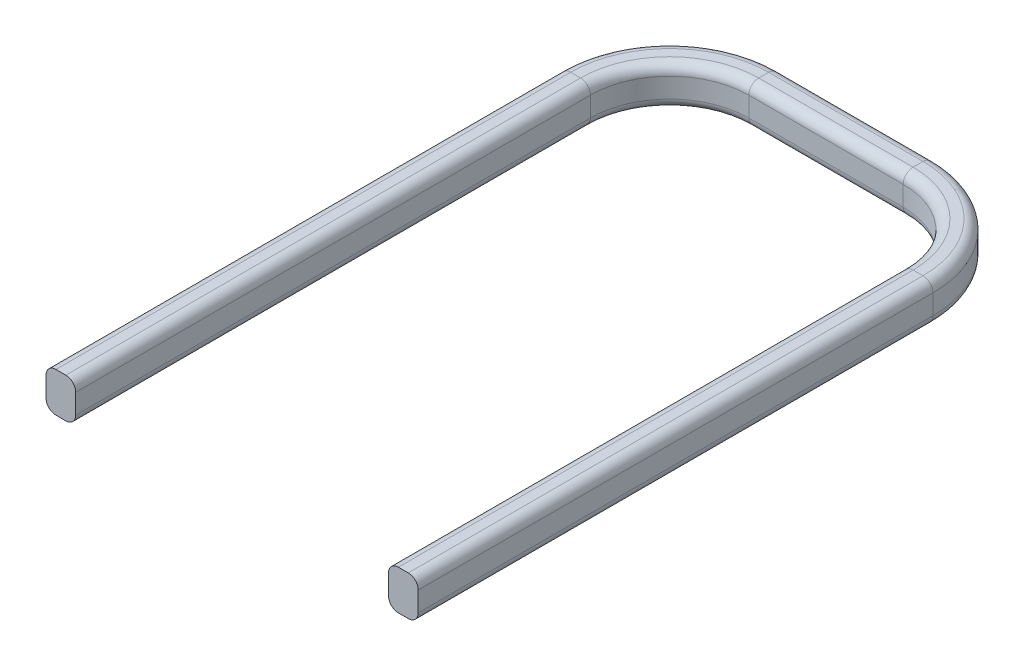
ISO-10303-21;
HEADER;
FILE_DESCRIPTION(('STEP AP214'),'2;1');
FILE_NAME('part.step','',(''),(''),'','','');
FILE_SCHEMA(('AUTOMOTIVE_DESIGN { 1 0 10303 214 1 1 1 1 }'));
ENDSEC;
DATA;
#1=APPLICATION_CONTEXT('core data for automotive mechanical design processes');
#2=APPLICATION_PROTOCOL_DEFINITION('international standard','automotive_design',2000,#1);
#3=PRODUCT_CONTEXT('',#1,'mechanical');
#4=PRODUCT('Part','Part','',(#3));
#5=PRODUCT_RELATED_PRODUCT_CATEGORY('part','',(#4));
#6=PRODUCT_DEFINITION_FORMATION('','',#4);
#7=PRODUCT_DEFINITION_CONTEXT('part definition',#1,'design');
#8=PRODUCT_DEFINITION('design','',#6,#7);
#9=PRODUCT_DEFINITION_SHAPE('','',#8);
#10=(LENGTH_UNIT() NAMED_UNIT(*) SI_UNIT(.MILLI.,.METRE.));
#11=(NAMED_UNIT(*) PLANE_ANGLE_UNIT() SI_UNIT($,.RADIAN.));
#12=(NAMED_UNIT(*) SI_UNIT($,.STERADIAN.) SOLID_ANGLE_UNIT());
#13=UNCERTAINTY_MEASURE_WITH_UNIT(LENGTH_MEASURE(1.E-05),#10,'distance_accuracy_value','');
#14=(GEOMETRIC_REPRESENTATION_CONTEXT(3) GLOBAL_UNCERTAINTY_ASSIGNED_CONTEXT((#13)) GLOBAL_UNIT_ASSIGNED_CONTEXT((#10,
#11,#12)) REPRESENTATION_CONTEXT('',''));
#15=CARTESIAN_POINT('',(0.,0.,0.));
#16=DIRECTION('',(0.,0.,1.));
#17=DIRECTION('',(1.,0.,0.));
#18=AXIS2_PLACEMENT_3D('',#15,#16,#17);
#19=CARTESIAN_POINT('',(0.,0.,0.));
#20=DIRECTION('',(0.,0.,1.));
#21=DIRECTION('',(1.,0.,0.));
#22=AXIS2_PLACEMENT_3D('',#19,#20,#21);
#23=PLANE('',#22);
#24=DIRECTION('',(0.,-1.,0.));
#25=VECTOR('',#24,1.);
#26=CARTESIAN_POINT('',(-4.7,0.,0.));
#27=LINE('',#26,#25);
#28=CARTESIAN_POINT('',(-4.7,0.75,0.));
#29=VERTEX_POINT('',#28);
#30=CARTESIAN_POINT('',(-4.7,0.25,0.));
#31=VERTEX_POINT('',#30);
#32=EDGE_CURVE('E413',#29,#31,#27,.T.);
#33=ORIENTED_EDGE('',*,*,#32,.T.);
#34=CARTESIAN_POINT('',(-4.45,0.25,0.));
#35=DIRECTION('',(0.,0.,1.));
#36=DIRECTION('',(1.,0.,0.));
#37=AXIS2_PLACEMENT_3D('',#34,#35,#36);
#38=CIRCLE('',#37,0.25);
#39=CARTESIAN_POINT('',(-4.45,0.,0.));
#40=VERTEX_POINT('',#39);
#41=EDGE_CURVE('E272',#31,#40,#38,.T.);
#42=ORIENTED_EDGE('',*,*,#41,.T.);
#43=DIRECTION('',(1.,0.,0.));
#44=VECTOR('',#43,1.);
#45=CARTESIAN_POINT('',(-3.95,0.,0.));
#46=LINE('',#45,#44);
#47=CARTESIAN_POINT('',(-4.2,0.,0.));
#48=VERTEX_POINT('',#47);
#49=EDGE_CURVE('E227',#40,#48,#46,.T.);
#50=ORIENTED_EDGE('',*,*,#49,.T.);
#51=CARTESIAN_POINT('',(-4.2,0.25,0.));
#52=DIRECTION('',(0.,0.,1.));
#53=DIRECTION('',(1.,0.,0.));
#54=AXIS2_PLACEMENT_3D('',#51,#52,#53);
#55=CIRCLE('',#54,0.25);
#56=CARTESIAN_POINT('',(-3.95,0.25,0.));
#57=VERTEX_POINT('',#56);
#58=EDGE_CURVE('E270',#48,#57,#55,.T.);
#59=ORIENTED_EDGE('',*,*,#58,.T.);
#60=DIRECTION('',(0.,1.,0.));
#61=VECTOR('',#60,1.);
#62=CARTESIAN_POINT('',(-3.95,0.,0.));
#63=LINE('',#62,#61);
#64=CARTESIAN_POINT('',(-3.95,0.75,0.));
#65=VERTEX_POINT('',#64);
#66=EDGE_CURVE('E356',#57,#65,#63,.T.);
#67=ORIENTED_EDGE('',*,*,#66,.T.);
#68=CARTESIAN_POINT('',(-4.2,0.75,0.));
#69=DIRECTION('',(0.,0.,1.));
#70=DIRECTION('',(1.,0.,0.));
#71=AXIS2_PLACEMENT_3D('',#68,#69,#70);
#72=CIRCLE('',#71,0.25);
#73=CARTESIAN_POINT('',(-4.2,1.,0.));
#74=VERTEX_POINT('',#73);
#75=EDGE_CURVE('E266',#65,#74,#72,.T.);
#76=ORIENTED_EDGE('',*,*,#75,.T.);
#77=DIRECTION('',(-1.,0.,0.));
#78=VECTOR('',#77,1.);
#79=CARTESIAN_POINT('',(-3.95,1.,0.));
#80=LINE('',#79,#78);
#81=CARTESIAN_POINT('',(-4.45,1.,0.));
#82=VERTEX_POINT('',#81);
#83=EDGE_CURVE('E411',#74,#82,#80,.T.);
#84=ORIENTED_EDGE('',*,*,#83,.T.);
#85=CARTESIAN_POINT('',(-4.45,0.75,0.));
#86=DIRECTION('',(0.,0.,1.));
#87=DIRECTION('',(1.,0.,0.));
#88=AXIS2_PLACEMENT_3D('',#85,#86,#87);
#89=CIRCLE('',#88,0.25);
#90=EDGE_CURVE('E268',#82,#29,#89,.T.);
#91=ORIENTED_EDGE('',*,*,#90,.T.);
#92=EDGE_LOOP('',(#33,#42,#50,#59,#67,#76,#84,#91));
#93=FACE_BOUND('',#92,.T.);
#94=ADVANCED_FACE('F33',(#93),#23,.T.);
#95=CARTESIAN_POINT('',(0.,0.,0.));
#96=DIRECTION('',(0.,0.,-1.));
#97=DIRECTION('',(-1.,0.,0.));
#98=AXIS2_PLACEMENT_3D('',#95,#96,#97);
#99=PLANE('',#98);
#100=DIRECTION('',(0.,1.,0.));
#101=VECTOR('',#100,1.);
#102=CARTESIAN_POINT('',(3.95,0.,0.));
#103=LINE('',#102,#101);
#104=CARTESIAN_POINT('',(3.95,0.25,0.));
#105=VERTEX_POINT('',#104);
#106=CARTESIAN_POINT('',(3.95,0.75,0.));
#107=VERTEX_POINT('',#106);
#108=EDGE_CURVE('E257',#105,#107,#103,.T.);
#109=ORIENTED_EDGE('',*,*,#108,.F.);
#110=CARTESIAN_POINT('',(4.2,0.25,0.));
#111=DIRECTION('',(0.,0.,-1.));
#112=DIRECTION('',(-1.,0.,0.));
#113=AXIS2_PLACEMENT_3D('',#110,#111,#112);
#114=CIRCLE('',#113,0.25);
#115=CARTESIAN_POINT('',(4.2,0.,0.));
#116=VERTEX_POINT('',#115);
#117=EDGE_CURVE('E309',#105,#116,#114,.F.);
#118=ORIENTED_EDGE('',*,*,#117,.T.);
#119=DIRECTION('',(-1.,0.,0.));
#120=VECTOR('',#119,1.);
#121=CARTESIAN_POINT('',(3.95,0.,0.));
#122=LINE('',#121,#120);
#123=CARTESIAN_POINT('',(4.45,0.,0.));
#124=VERTEX_POINT('',#123);
#125=EDGE_CURVE('E259',#124,#116,#122,.T.);
#126=ORIENTED_EDGE('',*,*,#125,.F.);
#127=CARTESIAN_POINT('',(4.45,0.25,0.));
#128=DIRECTION('',(0.,0.,-1.));
#129=DIRECTION('',(-1.,0.,0.));
#130=AXIS2_PLACEMENT_3D('',#127,#128,#129);
#131=CIRCLE('',#130,0.25);
#132=CARTESIAN_POINT('',(4.7,0.25,0.));
#133=VERTEX_POINT('',#132);
#134=EDGE_CURVE('E303',#124,#133,#131,.F.);
#135=ORIENTED_EDGE('',*,*,#134,.T.);
#136=DIRECTION('',(0.,-1.,0.));
#137=VECTOR('',#136,1.);
#138=CARTESIAN_POINT('',(4.7,0.,0.));
#139=LINE('',#138,#137);
#140=CARTESIAN_POINT('',(4.7,0.75,0.));
#141=VERTEX_POINT('',#140);
#142=EDGE_CURVE('E262',#141,#133,#139,.T.);
#143=ORIENTED_EDGE('',*,*,#142,.F.);
#144=CARTESIAN_POINT('',(4.45,0.75,0.));
#145=DIRECTION('',(0.,0.,-1.));
#146=DIRECTION('',(-1.,0.,0.));
#147=AXIS2_PLACEMENT_3D('',#144,#145,#146);
#148=CIRCLE('',#147,0.25);
#149=CARTESIAN_POINT('',(4.45,1.,0.));
#150=VERTEX_POINT('',#149);
#151=EDGE_CURVE('E307',#141,#150,#148,.F.);
#152=ORIENTED_EDGE('',*,*,#151,.T.);
#153=DIRECTION('',(1.,0.,0.));
#154=VECTOR('',#153,1.);
#155=CARTESIAN_POINT('',(3.95,1.,0.));
#156=LINE('',#155,#154);
#157=CARTESIAN_POINT('',(4.2,1.,0.));
#158=VERTEX_POINT('',#157);
#159=EDGE_CURVE('E424',#158,#150,#156,.T.);
#160=ORIENTED_EDGE('',*,*,#159,.F.);
#161=CARTESIAN_POINT('',(4.2,0.75,0.));
#162=DIRECTION('',(0.,0.,-1.));
#163=DIRECTION('',(-1.,0.,0.));
#164=AXIS2_PLACEMENT_3D('',#161,#162,#163);
#165=CIRCLE('',#164,0.25);
#166=EDGE_CURVE('E305',#158,#107,#165,.F.);
#167=ORIENTED_EDGE('',*,*,#166,.T.);
#168=EDGE_LOOP('',(#109,#118,#126,#135,#143,#152,#160,#167));
#169=FACE_BOUND('',#168,.T.);
#170=ADVANCED_FACE('F481',(#169),#99,.F.);
#171=CARTESIAN_POINT('',(-3.95,0.,0.));
#172=DIRECTION('',(-1.,0.,0.));
#173=DIRECTION('',(0.,0.,1.));
#174=AXIS2_PLACEMENT_3D('',#171,#172,#173);
#175=PLANE('',#174);
#176=ORIENTED_EDGE('',*,*,#66,.F.);
#177=DIRECTION('',(0.,0.,-1.));
#178=VECTOR('',#177,1.);
#179=CARTESIAN_POINT('',(-3.95,0.25,0.));
#180=LINE('',#179,#178);
#181=CARTESIAN_POINT('',(-3.95,0.25,-13.));
#182=VERTEX_POINT('',#181);
#183=EDGE_CURVE('E296',#57,#182,#180,.T.);
#184=ORIENTED_EDGE('',*,*,#183,.T.);
#185=DIRECTION('',(0.,1.,0.));
#186=VECTOR('',#185,1.);
#187=CARTESIAN_POINT('',(-3.95,0.,-13.));
#188=LINE('',#187,#186);
#189=CARTESIAN_POINT('',(-3.95,0.75,-13.));
#190=VERTEX_POINT('',#189);
#191=EDGE_CURVE('E406',#182,#190,#188,.T.);
#192=ORIENTED_EDGE('',*,*,#191,.T.);
#193=DIRECTION('',(0.,0.,-1.));
#194=VECTOR('',#193,1.);
#195=CARTESIAN_POINT('',(-3.95,0.75,0.));
#196=LINE('',#195,#194);
#197=EDGE_CURVE('E294',#190,#65,#196,.F.);
#198=ORIENTED_EDGE('',*,*,#197,.T.);
#199=EDGE_LOOP('',(#176,#184,#192,#198));
#200=FACE_BOUND('',#199,.T.);
#201=ADVANCED_FACE('F403',(#200),#175,.F.);
#202=CARTESIAN_POINT('',(-3.95,1.,0.));
#203=DIRECTION('',(0.,-1.,0.));
#204=DIRECTION('',(1.,0.,0.));
#205=AXIS2_PLACEMENT_3D('',#202,#203,#204);
#206=PLANE('',#205);
#207=DIRECTION('',(-1.,0.,0.));
#208=VECTOR('',#207,1.);
#209=CARTESIAN_POINT('',(-3.95,1.,-13.));
#210=LINE('',#209,#208);
#211=CARTESIAN_POINT('',(-4.2,1.,-13.));
#212=VERTEX_POINT('',#211);
#213=CARTESIAN_POINT('',(-4.45,1.,-13.));
#214=VERTEX_POINT('',#213);
#215=EDGE_CURVE('E240',#212,#214,#210,.T.);
#216=ORIENTED_EDGE('',*,*,#215,.T.);
#217=DIRECTION('',(0.,0.,-1.));
#218=VECTOR('',#217,1.);
#219=CARTESIAN_POINT('',(-4.45,1.,0.));
#220=LINE('',#219,#218);
#221=EDGE_CURVE('E11',#214,#82,#220,.F.);
#222=ORIENTED_EDGE('',*,*,#221,.T.);
#223=ORIENTED_EDGE('',*,*,#83,.F.);
#224=DIRECTION('',(0.,0.,-1.));
#225=VECTOR('',#224,1.);
#226=CARTESIAN_POINT('',(-4.2,1.,0.));
#227=LINE('',#226,#225);
#228=EDGE_CURVE('E42',#74,#212,#227,.T.);
#229=ORIENTED_EDGE('',*,*,#228,.T.);
#230=EDGE_LOOP('',(#216,#222,#223,#229));
#231=FACE_BOUND('',#230,.T.);
#232=ADVANCED_FACE('F828',(#231),#206,.F.);
#233=CARTESIAN_POINT('',(-4.7,0.,0.));
#234=DIRECTION('',(1.,0.,0.));
#235=DIRECTION('',(0.,0.,-1.));
#236=AXIS2_PLACEMENT_3D('',#233,#234,#235);
#237=PLANE('',#236);
#238=DIRECTION('',(0.,-1.,0.));
#239=VECTOR('',#238,1.);
#240=CARTESIAN_POINT('',(-4.7,0.,-13.));
#241=LINE('',#240,#239);
#242=CARTESIAN_POINT('',(-4.7,0.75,-13.));
#243=VERTEX_POINT('',#242);
#244=CARTESIAN_POINT('',(-4.7,0.25,-13.));
#245=VERTEX_POINT('',#244);
#246=EDGE_CURVE('E234',#243,#245,#241,.T.);
#247=ORIENTED_EDGE('',*,*,#246,.T.);
#248=DIRECTION('',(0.,0.,-1.));
#249=VECTOR('',#248,1.);
#250=CARTESIAN_POINT('',(-4.7,0.25,0.));
#251=LINE('',#250,#249);
#252=EDGE_CURVE('E203',#245,#31,#251,.F.);
#253=ORIENTED_EDGE('',*,*,#252,.T.);
#254=ORIENTED_EDGE('',*,*,#32,.F.);
#255=DIRECTION('',(0.,0.,-1.));
#256=VECTOR('',#255,1.);
#257=CARTESIAN_POINT('',(-4.7,0.75,0.));
#258=LINE('',#257,#256);
#259=EDGE_CURVE('E228',#29,#243,#258,.T.);
#260=ORIENTED_EDGE('',*,*,#259,.T.);
#261=EDGE_LOOP('',(#247,#253,#254,#260));
#262=FACE_BOUND('',#261,.T.);
#263=ADVANCED_FACE('F519',(#262),#237,.F.);
#264=CARTESIAN_POINT('',(-3.95,0.,0.));
#265=DIRECTION('',(0.,1.,0.));
#266=DIRECTION('',(-1.,0.,0.));
#267=AXIS2_PLACEMENT_3D('',#264,#265,#266);
#268=PLANE('',#267);
#269=ORIENTED_EDGE('',*,*,#49,.F.);
#270=DIRECTION('',(0.,0.,-1.));
#271=VECTOR('',#270,1.);
#272=CARTESIAN_POINT('',(-4.45,0.,0.));
#273=LINE('',#272,#271);
#274=CARTESIAN_POINT('',(-4.45,0.,-13.));
#275=VERTEX_POINT('',#274);
#276=EDGE_CURVE('E202',#40,#275,#273,.T.);
#277=ORIENTED_EDGE('',*,*,#276,.T.);
#278=DIRECTION('',(1.,0.,0.));
#279=VECTOR('',#278,1.);
#280=CARTESIAN_POINT('',(-3.95,0.,-13.));
#281=LINE('',#280,#279);
#282=CARTESIAN_POINT('',(-4.2,0.,-13.));
#283=VERTEX_POINT('',#282);
#284=EDGE_CURVE('E224',#275,#283,#281,.T.);
#285=ORIENTED_EDGE('',*,*,#284,.T.);
#286=DIRECTION('',(0.,0.,-1.));
#287=VECTOR('',#286,1.);
#288=CARTESIAN_POINT('',(-4.2,0.,0.));
#289=LINE('',#288,#287);
#290=EDGE_CURVE('E229',#283,#48,#289,.F.);
#291=ORIENTED_EDGE('',*,*,#290,.T.);
#292=EDGE_LOOP('',(#269,#277,#285,#291));
#293=FACE_BOUND('',#292,.T.);
#294=ADVANCED_FACE('F223',(#293),#268,.F.);
#295=CARTESIAN_POINT('',(-1.95,0.,-13.));
#296=DIRECTION('',(0.,-1.,0.));
#297=DIRECTION('',(0.,0.,-1.));
#298=AXIS2_PLACEMENT_3D('',#295,#296,#297);
#299=CYLINDRICAL_SURFACE('',#298,2.);
#300=DIRECTION('',(0.,1.,0.));
#301=VECTOR('',#300,1.);
#302=CARTESIAN_POINT('',(-1.95,0.,-15.));
#303=LINE('',#302,#301);
#304=CARTESIAN_POINT('',(-1.95,0.25,-15.));
#305=VERTEX_POINT('',#304);
#306=CARTESIAN_POINT('',(-1.95,0.75,-15.));
#307=VERTEX_POINT('',#306);
#308=EDGE_CURVE('E233',#305,#307,#303,.T.);
#309=ORIENTED_EDGE('',*,*,#308,.T.);
#310=CARTESIAN_POINT('',(-1.95,0.75,-13.));
#311=DIRECTION('',(0.,-1.,0.));
#312=DIRECTION('',(0.,0.,-1.));
#313=AXIS2_PLACEMENT_3D('',#310,#311,#312);
#314=CIRCLE('',#313,2.);
#315=EDGE_CURVE('E346',#307,#190,#314,.F.);
#316=ORIENTED_EDGE('',*,*,#315,.T.);
#317=ORIENTED_EDGE('',*,*,#191,.F.);
#318=CARTESIAN_POINT('',(-1.95,0.25,-13.));
#319=DIRECTION('',(0.,1.,0.));
#320=DIRECTION('',(0.,0.,1.));
#321=AXIS2_PLACEMENT_3D('',#318,#319,#320);
#322=CIRCLE('',#321,2.);
#323=EDGE_CURVE('E344',#182,#305,#322,.F.);
#324=ORIENTED_EDGE('',*,*,#323,.T.);
#325=EDGE_LOOP('',(#309,#316,#317,#324));
#326=FACE_BOUND('',#325,.T.);
#327=ADVANCED_FACE('F805',(#326),#299,.F.);
#328=CARTESIAN_POINT('',(-3.95,1.,-13.));
#329=DIRECTION('',(0.,-1.,0.));
#330=DIRECTION('',(0.,0.,-1.));
#331=AXIS2_PLACEMENT_3D('',#328,#329,#330);
#332=PLANE('',#331);
#333=DIRECTION('',(0.,0.,-1.));
#334=VECTOR('',#333,1.);
#335=CARTESIAN_POINT('',(-1.95,1.,-15.));
#336=LINE('',#335,#334);
#337=CARTESIAN_POINT('',(-1.95,1.,-15.25));
#338=VERTEX_POINT('',#337);
#339=CARTESIAN_POINT('',(-1.95,1.,-15.5));
#340=VERTEX_POINT('',#339);
#341=EDGE_CURVE('E237',#338,#340,#336,.T.);
#342=ORIENTED_EDGE('',*,*,#341,.T.);
#343=CARTESIAN_POINT('',(-1.95,1.,-13.));
#344=DIRECTION('',(0.,-1.,0.));
#345=DIRECTION('',(0.,0.,-1.));
#346=AXIS2_PLACEMENT_3D('',#343,#344,#345);
#347=CIRCLE('',#346,2.5);
#348=EDGE_CURVE('E50',#340,#214,#347,.F.);
#349=ORIENTED_EDGE('',*,*,#348,.T.);
#350=ORIENTED_EDGE('',*,*,#215,.F.);
#351=CARTESIAN_POINT('',(-1.95,1.,-13.));
#352=DIRECTION('',(0.,-1.,0.));
#353=DIRECTION('',(0.,0.,-1.));
#354=AXIS2_PLACEMENT_3D('',#351,#352,#353);
#355=CIRCLE('',#354,2.25);
#356=EDGE_CURVE('E341',#212,#338,#355,.T.);
#357=ORIENTED_EDGE('',*,*,#356,.T.);
#358=EDGE_LOOP('',(#342,#349,#350,#357));
#359=FACE_BOUND('',#358,.T.);
#360=ADVANCED_FACE('F797',(#359),#332,.F.);
#361=CARTESIAN_POINT('',(-1.95,0.,-13.));
#362=DIRECTION('',(0.,-1.,0.));
#363=DIRECTION('',(0.,0.,-1.));
#364=AXIS2_PLACEMENT_3D('',#361,#362,#363);
#365=CYLINDRICAL_SURFACE('',#364,2.75);
#366=DIRECTION('',(0.,-1.,0.));
#367=VECTOR('',#366,1.);
#368=CARTESIAN_POINT('',(-1.95,0.,-15.75));
#369=LINE('',#368,#367);
#370=CARTESIAN_POINT('',(-1.95,0.75,-15.75));
#371=VERTEX_POINT('',#370);
#372=CARTESIAN_POINT('',(-1.95,0.25,-15.75));
#373=VERTEX_POINT('',#372);
#374=EDGE_CURVE('E248',#371,#373,#369,.T.);
#375=ORIENTED_EDGE('',*,*,#374,.T.);
#376=CARTESIAN_POINT('',(-1.95,0.25,-13.));
#377=DIRECTION('',(0.,1.,0.));
#378=DIRECTION('',(0.,0.,1.));
#379=AXIS2_PLACEMENT_3D('',#376,#377,#378);
#380=CIRCLE('',#379,2.75);
#381=EDGE_CURVE('E276',#373,#245,#380,.T.);
#382=ORIENTED_EDGE('',*,*,#381,.T.);
#383=ORIENTED_EDGE('',*,*,#246,.F.);
#384=CARTESIAN_POINT('',(-1.95,0.75,-13.));
#385=DIRECTION('',(0.,-1.,0.));
#386=DIRECTION('',(0.,0.,-1.));
#387=AXIS2_PLACEMENT_3D('',#384,#385,#386);
#388=CIRCLE('',#387,2.75);
#389=EDGE_CURVE('E217',#243,#371,#388,.T.);
#390=ORIENTED_EDGE('',*,*,#389,.T.);
#391=EDGE_LOOP('',(#375,#382,#383,#390));
#392=FACE_BOUND('',#391,.T.);
#393=ADVANCED_FACE('F516',(#392),#365,.T.);
#394=CARTESIAN_POINT('',(-3.95,0.,-13.));
#395=DIRECTION('',(0.,1.,0.));
#396=DIRECTION('',(0.,0.,1.));
#397=AXIS2_PLACEMENT_3D('',#394,#395,#396);
#398=PLANE('',#397);
#399=ORIENTED_EDGE('',*,*,#284,.F.);
#400=CARTESIAN_POINT('',(-1.95,0.,-13.));
#401=DIRECTION('',(0.,1.,0.));
#402=DIRECTION('',(0.,0.,1.));
#403=AXIS2_PLACEMENT_3D('',#400,#401,#402);
#404=CIRCLE('',#403,2.5);
#405=CARTESIAN_POINT('',(-1.95,0.,-15.5));
#406=VERTEX_POINT('',#405);
#407=EDGE_CURVE('E210',#275,#406,#404,.F.);
#408=ORIENTED_EDGE('',*,*,#407,.T.);
#409=DIRECTION('',(0.,0.,1.));
#410=VECTOR('',#409,1.);
#411=CARTESIAN_POINT('',(-1.95,0.,-15.));
#412=LINE('',#411,#410);
#413=CARTESIAN_POINT('',(-1.95,0.,-15.25));
#414=VERTEX_POINT('',#413);
#415=EDGE_CURVE('E245',#406,#414,#412,.T.);
#416=ORIENTED_EDGE('',*,*,#415,.T.);
#417=CARTESIAN_POINT('',(-1.95,0.,-13.));
#418=DIRECTION('',(0.,1.,0.));
#419=DIRECTION('',(0.,0.,1.));
#420=AXIS2_PLACEMENT_3D('',#417,#418,#419);
#421=CIRCLE('',#420,2.25);
#422=EDGE_CURVE('E218',#414,#283,#421,.T.);
#423=ORIENTED_EDGE('',*,*,#422,.T.);
#424=EDGE_LOOP('',(#399,#408,#416,#423));
#425=FACE_BOUND('',#424,.T.);
#426=ADVANCED_FACE('F231',(#425),#398,.F.);
#427=CARTESIAN_POINT('',(-1.95,0.,-15.));
#428=DIRECTION('',(0.,0.,-1.));
#429=DIRECTION('',(-1.,0.,0.));
#430=AXIS2_PLACEMENT_3D('',#427,#428,#429);
#431=PLANE('',#430);
#432=ORIENTED_EDGE('',*,*,#308,.F.);
#433=DIRECTION('',(1.,0.,0.));
#434=VECTOR('',#433,1.);
#435=CARTESIAN_POINT('',(-1.95,0.25,-15.));
#436=LINE('',#435,#434);
#437=CARTESIAN_POINT('',(1.94999999999999,0.25,-15.));
#438=VERTEX_POINT('',#437);
#439=EDGE_CURVE('E321',#305,#438,#436,.T.);
#440=ORIENTED_EDGE('',*,*,#439,.T.);
#441=DIRECTION('',(0.,1.,0.));
#442=VECTOR('',#441,1.);
#443=CARTESIAN_POINT('',(1.94999999999999,0.,-15.));
#444=LINE('',#443,#442);
#445=CARTESIAN_POINT('',(1.94999999999999,0.75,-15.));
#446=VERTEX_POINT('',#445);
#447=EDGE_CURVE('E247',#438,#446,#444,.T.);
#448=ORIENTED_EDGE('',*,*,#447,.T.);
#449=DIRECTION('',(1.,0.,0.));
#450=VECTOR('',#449,1.);
#451=CARTESIAN_POINT('',(-1.95,0.75,-15.));
#452=LINE('',#451,#450);
#453=EDGE_CURVE('E319',#446,#307,#452,.F.);
#454=ORIENTED_EDGE('',*,*,#453,.T.);
#455=EDGE_LOOP('',(#432,#440,#448,#454));
#456=FACE_BOUND('',#455,.T.);
#457=ADVANCED_FACE('F773',(#456),#431,.F.);
#458=CARTESIAN_POINT('',(-1.95,1.,-15.));
#459=DIRECTION('',(0.,-1.,0.));
#460=DIRECTION('',(0.,0.,-1.));
#461=AXIS2_PLACEMENT_3D('',#458,#459,#460);
#462=PLANE('',#461);
#463=DIRECTION('',(0.,0.,-1.));
#464=VECTOR('',#463,1.);
#465=CARTESIAN_POINT('',(1.94999999999999,1.,-15.));
#466=LINE('',#465,#464);
#467=CARTESIAN_POINT('',(1.94999999999999,1.,-15.25));
#468=VERTEX_POINT('',#467);
#469=CARTESIAN_POINT('',(1.94999999999999,1.,-15.5));
#470=VERTEX_POINT('',#469);
#471=EDGE_CURVE('E419',#468,#470,#466,.T.);
#472=ORIENTED_EDGE('',*,*,#471,.T.);
#473=DIRECTION('',(1.,0.,0.));
#474=VECTOR('',#473,1.);
#475=CARTESIAN_POINT('',(-1.95,1.,-15.5));
#476=LINE('',#475,#474);
#477=EDGE_CURVE('E339',#470,#340,#476,.F.);
#478=ORIENTED_EDGE('',*,*,#477,.T.);
#479=ORIENTED_EDGE('',*,*,#341,.F.);
#480=DIRECTION('',(1.,0.,0.));
#481=VECTOR('',#480,1.);
#482=CARTESIAN_POINT('',(-1.95,1.,-15.25));
#483=LINE('',#482,#481);
#484=EDGE_CURVE('E337',#338,#468,#483,.T.);
#485=ORIENTED_EDGE('',*,*,#484,.T.);
#486=EDGE_LOOP('',(#472,#478,#479,#485));
#487=FACE_BOUND('',#486,.T.);
#488=ADVANCED_FACE('F765',(#487),#462,.F.);
#489=CARTESIAN_POINT('',(-1.95,0.,-15.75));
#490=DIRECTION('',(0.,0.,1.));
#491=DIRECTION('',(1.,0.,0.));
#492=AXIS2_PLACEMENT_3D('',#489,#490,#491);
#493=PLANE('',#492);
#494=DIRECTION('',(0.,-1.,0.));
#495=VECTOR('',#494,1.);
#496=CARTESIAN_POINT('',(1.94999999999999,0.,-15.75));
#497=LINE('',#496,#495);
#498=CARTESIAN_POINT('',(1.94999999999999,0.75,-15.75));
#499=VERTEX_POINT('',#498);
#500=CARTESIAN_POINT('',(1.94999999999999,0.25,-15.75));
#501=VERTEX_POINT('',#500);
#502=EDGE_CURVE('E253',#499,#501,#497,.T.);
#503=ORIENTED_EDGE('',*,*,#502,.T.);
#504=DIRECTION('',(1.,0.,0.));
#505=VECTOR('',#504,1.);
#506=CARTESIAN_POINT('',(-1.95,0.25,-15.75));
#507=LINE('',#506,#505);
#508=EDGE_CURVE('E284',#501,#373,#507,.F.);
#509=ORIENTED_EDGE('',*,*,#508,.T.);
#510=ORIENTED_EDGE('',*,*,#374,.F.);
#511=DIRECTION('',(1.,0.,0.));
#512=VECTOR('',#511,1.);
#513=CARTESIAN_POINT('',(-1.95,0.75,-15.75));
#514=LINE('',#513,#512);
#515=EDGE_CURVE('E282',#371,#499,#514,.T.);
#516=ORIENTED_EDGE('',*,*,#515,.T.);
#517=EDGE_LOOP('',(#503,#509,#510,#516));
#518=FACE_BOUND('',#517,.T.);
#519=ADVANCED_FACE('F464',(#518),#493,.F.);
#520=CARTESIAN_POINT('',(-1.95,0.,-15.));
#521=DIRECTION('',(0.,1.,0.));
#522=DIRECTION('',(0.,0.,1.));
#523=AXIS2_PLACEMENT_3D('',#520,#521,#522);
#524=PLANE('',#523);
#525=ORIENTED_EDGE('',*,*,#415,.F.);
#526=DIRECTION('',(1.,0.,0.));
#527=VECTOR('',#526,1.);
#528=CARTESIAN_POINT('',(-1.95,0.,-15.5));
#529=LINE('',#528,#527);
#530=CARTESIAN_POINT('',(1.94999999999999,0.,-15.5));
#531=VERTEX_POINT('',#530);
#532=EDGE_CURVE('E280',#406,#531,#529,.T.);
#533=ORIENTED_EDGE('',*,*,#532,.T.);
#534=DIRECTION('',(0.,0.,1.));
#535=VECTOR('',#534,1.);
#536=CARTESIAN_POINT('',(1.94999999999999,0.,-15.));
#537=LINE('',#536,#535);
#538=CARTESIAN_POINT('',(1.94999999999999,0.,-15.25));
#539=VERTEX_POINT('',#538);
#540=EDGE_CURVE('E249',#531,#539,#537,.T.);
#541=ORIENTED_EDGE('',*,*,#540,.T.);
#542=DIRECTION('',(1.,0.,0.));
#543=VECTOR('',#542,1.);
#544=CARTESIAN_POINT('',(-1.95,0.,-15.25));
#545=LINE('',#544,#543);
#546=EDGE_CURVE('E278',#539,#414,#545,.F.);
#547=ORIENTED_EDGE('',*,*,#546,.T.);
#548=EDGE_LOOP('',(#525,#533,#541,#547));
#549=FACE_BOUND('',#548,.T.);
#550=ADVANCED_FACE('F510',(#549),#524,.F.);
#551=CARTESIAN_POINT('',(1.95,0.,-13.));
#552=DIRECTION('',(0.,-1.,0.));
#553=DIRECTION('',(0.,0.,-1.));
#554=AXIS2_PLACEMENT_3D('',#551,#552,#553);
#555=CYLINDRICAL_SURFACE('',#554,2.);
#556=ORIENTED_EDGE('',*,*,#447,.F.);
#557=CARTESIAN_POINT('',(1.95,0.25,-13.));
#558=DIRECTION('',(0.,1.,0.));
#559=DIRECTION('',(0.,0.,1.));
#560=AXIS2_PLACEMENT_3D('',#557,#558,#559);
#561=CIRCLE('',#560,2.);
#562=CARTESIAN_POINT('',(3.95,0.25,-13.));
#563=VERTEX_POINT('',#562);
#564=EDGE_CURVE('E317',#438,#563,#561,.F.);
#565=ORIENTED_EDGE('',*,*,#564,.T.);
#566=DIRECTION('',(0.,1.,0.));
#567=VECTOR('',#566,1.);
#568=CARTESIAN_POINT('',(3.95,0.,-13.));
#569=LINE('',#568,#567);
#570=CARTESIAN_POINT('',(3.95,0.75,-13.));
#571=VERTEX_POINT('',#570);
#572=EDGE_CURVE('E252',#563,#571,#569,.T.);
#573=ORIENTED_EDGE('',*,*,#572,.T.);
#574=CARTESIAN_POINT('',(1.95,0.75,-13.));
#575=DIRECTION('',(0.,-1.,0.));
#576=DIRECTION('',(0.,0.,-1.));
#577=AXIS2_PLACEMENT_3D('',#574,#575,#576);
#578=CIRCLE('',#577,2.);
#579=EDGE_CURVE('E315',#571,#446,#578,.F.);
#580=ORIENTED_EDGE('',*,*,#579,.T.);
#581=EDGE_LOOP('',(#556,#565,#573,#580));
#582=FACE_BOUND('',#581,.T.);
#583=ADVANCED_FACE('F742',(#582),#555,.F.);
#584=CARTESIAN_POINT('',(1.94999999999999,1.,-15.));
#585=DIRECTION('',(0.,-1.,0.));
#586=DIRECTION('',(0.,0.,-1.));
#587=AXIS2_PLACEMENT_3D('',#584,#585,#586);
#588=PLANE('',#587);
#589=DIRECTION('',(1.,0.,0.));
#590=VECTOR('',#589,1.);
#591=CARTESIAN_POINT('',(3.95,1.,-13.));
#592=LINE('',#591,#590);
#593=CARTESIAN_POINT('',(4.2,1.,-13.));
#594=VERTEX_POINT('',#593);
#595=CARTESIAN_POINT('',(4.45,1.,-13.));
#596=VERTEX_POINT('',#595);
#597=EDGE_CURVE('E422',#594,#596,#592,.T.);
#598=ORIENTED_EDGE('',*,*,#597,.T.);
#599=CARTESIAN_POINT('',(1.95,1.,-13.));
#600=DIRECTION('',(0.,-1.,0.));
#601=DIRECTION('',(0.,0.,-1.));
#602=AXIS2_PLACEMENT_3D('',#599,#600,#601);
#603=CIRCLE('',#602,2.5);
#604=EDGE_CURVE('E335',#596,#470,#603,.F.);
#605=ORIENTED_EDGE('',*,*,#604,.T.);
#606=ORIENTED_EDGE('',*,*,#471,.F.);
#607=CARTESIAN_POINT('',(1.95,1.,-13.));
#608=DIRECTION('',(0.,-1.,0.));
#609=DIRECTION('',(0.,0.,-1.));
#610=AXIS2_PLACEMENT_3D('',#607,#608,#609);
#611=CIRCLE('',#610,2.25);
#612=EDGE_CURVE('E333',#468,#594,#611,.T.);
#613=ORIENTED_EDGE('',*,*,#612,.T.);
#614=EDGE_LOOP('',(#598,#605,#606,#613));
#615=FACE_BOUND('',#614,.T.);
#616=ADVANCED_FACE('F734',(#615),#588,.F.);
#617=CARTESIAN_POINT('',(1.95,0.,-13.));
#618=DIRECTION('',(0.,-1.,0.));
#619=DIRECTION('',(0.,0.,-1.));
#620=AXIS2_PLACEMENT_3D('',#617,#618,#619);
#621=CYLINDRICAL_SURFACE('',#620,2.75);
#622=DIRECTION('',(0.,-1.,0.));
#623=VECTOR('',#622,1.);
#624=CARTESIAN_POINT('',(4.7,0.,-13.));
#625=LINE('',#624,#623);
#626=CARTESIAN_POINT('',(4.7,0.75,-13.));
#627=VERTEX_POINT('',#626);
#628=CARTESIAN_POINT('',(4.7,0.25,-13.));
#629=VERTEX_POINT('',#628);
#630=EDGE_CURVE('E258',#627,#629,#625,.T.);
#631=ORIENTED_EDGE('',*,*,#630,.T.);
#632=CARTESIAN_POINT('',(1.95,0.25,-13.));
#633=DIRECTION('',(0.,1.,0.));
#634=DIRECTION('',(0.,0.,1.));
#635=AXIS2_PLACEMENT_3D('',#632,#633,#634);
#636=CIRCLE('',#635,2.75);
#637=EDGE_CURVE('E292',#629,#501,#636,.T.);
#638=ORIENTED_EDGE('',*,*,#637,.T.);
#639=ORIENTED_EDGE('',*,*,#502,.F.);
#640=CARTESIAN_POINT('',(1.95,0.75,-13.));
#641=DIRECTION('',(0.,-1.,0.));
#642=DIRECTION('',(0.,0.,-1.));
#643=AXIS2_PLACEMENT_3D('',#640,#641,#642);
#644=CIRCLE('',#643,2.75);
#645=EDGE_CURVE('E290',#499,#627,#644,.T.);
#646=ORIENTED_EDGE('',*,*,#645,.T.);
#647=EDGE_LOOP('',(#631,#638,#639,#646));
#648=FACE_BOUND('',#647,.T.);
#649=ADVANCED_FACE('F461',(#648),#621,.T.);
#650=CARTESIAN_POINT('',(1.94999999999999,0.,-15.));
#651=DIRECTION('',(0.,1.,0.));
#652=DIRECTION('',(0.,0.,1.));
#653=AXIS2_PLACEMENT_3D('',#650,#651,#652);
#654=PLANE('',#653);
#655=ORIENTED_EDGE('',*,*,#540,.F.);
#656=CARTESIAN_POINT('',(1.95,0.,-13.));
#657=DIRECTION('',(0.,1.,0.));
#658=DIRECTION('',(0.,0.,1.));
#659=AXIS2_PLACEMENT_3D('',#656,#657,#658);
#660=CIRCLE('',#659,2.5);
#661=CARTESIAN_POINT('',(4.45,0.,-13.));
#662=VERTEX_POINT('',#661);
#663=EDGE_CURVE('E288',#531,#662,#660,.F.);
#664=ORIENTED_EDGE('',*,*,#663,.T.);
#665=DIRECTION('',(-1.,0.,0.));
#666=VECTOR('',#665,1.);
#667=CARTESIAN_POINT('',(3.95,0.,-13.));
#668=LINE('',#667,#666);
#669=CARTESIAN_POINT('',(4.2,0.,-13.));
#670=VERTEX_POINT('',#669);
#671=EDGE_CURVE('E254',#662,#670,#668,.T.);
#672=ORIENTED_EDGE('',*,*,#671,.T.);
#673=CARTESIAN_POINT('',(1.95,0.,-13.));
#674=DIRECTION('',(0.,1.,0.));
#675=DIRECTION('',(0.,0.,1.));
#676=AXIS2_PLACEMENT_3D('',#673,#674,#675);
#677=CIRCLE('',#676,2.25);
#678=EDGE_CURVE('E286',#670,#539,#677,.T.);
#679=ORIENTED_EDGE('',*,*,#678,.T.);
#680=EDGE_LOOP('',(#655,#664,#672,#679));
#681=FACE_BOUND('',#680,.T.);
#682=ADVANCED_FACE('F507',(#681),#654,.F.);
#683=CARTESIAN_POINT('',(3.95,0.,-13.));
#684=DIRECTION('',(1.,0.,0.));
#685=DIRECTION('',(0.,0.,-1.));
#686=AXIS2_PLACEMENT_3D('',#683,#684,#685);
#687=PLANE('',#686);
#688=ORIENTED_EDGE('',*,*,#572,.F.);
#689=DIRECTION('',(0.,0.,1.));
#690=VECTOR('',#689,1.);
#691=CARTESIAN_POINT('',(3.95,0.25,-13.));
#692=LINE('',#691,#690);
#693=EDGE_CURVE('E301',#563,#105,#692,.T.);
#694=ORIENTED_EDGE('',*,*,#693,.T.);
#695=ORIENTED_EDGE('',*,*,#108,.T.);
#696=DIRECTION('',(0.,0.,1.));
#697=VECTOR('',#696,1.);
#698=CARTESIAN_POINT('',(3.95,0.75,-13.));
#699=LINE('',#698,#697);
#700=EDGE_CURVE('E299',#107,#571,#699,.F.);
#701=ORIENTED_EDGE('',*,*,#700,.T.);
#702=EDGE_LOOP('',(#688,#694,#695,#701));
#703=FACE_BOUND('',#702,.T.);
#704=ADVANCED_FACE('F493',(#703),#687,.F.);
#705=CARTESIAN_POINT('',(3.95,1.,-13.));
#706=DIRECTION('',(0.,-1.,0.));
#707=DIRECTION('',(1.,0.,0.));
#708=AXIS2_PLACEMENT_3D('',#705,#706,#707);
#709=PLANE('',#708);
#710=ORIENTED_EDGE('',*,*,#159,.T.);
#711=DIRECTION('',(0.,0.,1.));
#712=VECTOR('',#711,1.);
#713=CARTESIAN_POINT('',(4.45,1.,-13.));
#714=LINE('',#713,#712);
#715=EDGE_CURVE('E331',#150,#596,#714,.F.);
#716=ORIENTED_EDGE('',*,*,#715,.T.);
#717=ORIENTED_EDGE('',*,*,#597,.F.);
#718=DIRECTION('',(0.,0.,1.));
#719=VECTOR('',#718,1.);
#720=CARTESIAN_POINT('',(4.2,1.,-13.));
#721=LINE('',#720,#719);
#722=EDGE_CURVE('E328',#594,#158,#721,.T.);
#723=ORIENTED_EDGE('',*,*,#722,.T.);
#724=EDGE_LOOP('',(#710,#716,#717,#723));
#725=FACE_BOUND('',#724,.T.);
#726=ADVANCED_FACE('F483',(#725),#709,.F.);
#727=CARTESIAN_POINT('',(4.7,0.,-13.));
#728=DIRECTION('',(-1.,0.,0.));
#729=DIRECTION('',(0.,0.,1.));
#730=AXIS2_PLACEMENT_3D('',#727,#728,#729);
#731=PLANE('',#730);
#732=ORIENTED_EDGE('',*,*,#630,.F.);
#733=DIRECTION('',(0.,0.,1.));
#734=VECTOR('',#733,1.);
#735=CARTESIAN_POINT('',(4.7,0.75,-13.));
#736=LINE('',#735,#734);
#737=EDGE_CURVE('E325',#627,#141,#736,.T.);
#738=ORIENTED_EDGE('',*,*,#737,.T.);
#739=ORIENTED_EDGE('',*,*,#142,.T.);
#740=DIRECTION('',(0.,0.,1.));
#741=VECTOR('',#740,1.);
#742=CARTESIAN_POINT('',(4.7,0.25,-13.));
#743=LINE('',#742,#741);
#744=EDGE_CURVE('E323',#133,#629,#743,.F.);
#745=ORIENTED_EDGE('',*,*,#744,.T.);
#746=EDGE_LOOP('',(#732,#738,#739,#745));
#747=FACE_BOUND('',#746,.T.);
#748=ADVANCED_FACE('F445',(#747),#731,.F.);
#749=CARTESIAN_POINT('',(3.95,0.,-13.));
#750=DIRECTION('',(0.,1.,0.));
#751=DIRECTION('',(-1.,0.,0.));
#752=AXIS2_PLACEMENT_3D('',#749,#750,#751);
#753=PLANE('',#752);
#754=ORIENTED_EDGE('',*,*,#125,.T.);
#755=DIRECTION('',(0.,0.,1.));
#756=VECTOR('',#755,1.);
#757=CARTESIAN_POINT('',(4.2,0.,-13.));
#758=LINE('',#757,#756);
#759=EDGE_CURVE('E313',#116,#670,#758,.F.);
#760=ORIENTED_EDGE('',*,*,#759,.T.);
#761=ORIENTED_EDGE('',*,*,#671,.F.);
#762=DIRECTION('',(0.,0.,1.));
#763=VECTOR('',#762,1.);
#764=CARTESIAN_POINT('',(4.45,0.,-13.));
#765=LINE('',#764,#763);
#766=EDGE_CURVE('E311',#662,#124,#765,.T.);
#767=ORIENTED_EDGE('',*,*,#766,.T.);
#768=EDGE_LOOP('',(#754,#760,#761,#767));
#769=FACE_BOUND('',#768,.T.);
#770=ADVANCED_FACE('F538',(#769),#753,.F.);
#771=CARTESIAN_POINT('',(4.45,0.25,-13.));
#772=DIRECTION('',(0.,0.,1.));
#773=DIRECTION('',(1.,0.,0.));
#774=AXIS2_PLACEMENT_3D('',#771,#772,#773);
#775=CYLINDRICAL_SURFACE('',#774,0.25);
#776=ORIENTED_EDGE('',*,*,#134,.F.);
#777=ORIENTED_EDGE('',*,*,#766,.F.);
#778=CARTESIAN_POINT('',(4.45,0.25,-13.));
#779=DIRECTION('',(0.,0.,-1.));
#780=DIRECTION('',(0.,1.,0.));
#781=AXIS2_PLACEMENT_3D('',#778,#779,#780);
#782=CIRCLE('',#781,0.25);
#783=EDGE_CURVE('E353',#629,#662,#782,.T.);
#784=ORIENTED_EDGE('',*,*,#783,.F.);
#785=ORIENTED_EDGE('',*,*,#744,.F.);
#786=EDGE_LOOP('',(#776,#777,#784,#785));
#787=FACE_BOUND('',#786,.T.);
#788=ADVANCED_FACE('F451',(#787),#775,.T.);
#789=CARTESIAN_POINT('',(1.95,0.25,-13.));
#790=DIRECTION('',(0.,1.,0.));
#791=DIRECTION('',(0.,0.,1.));
#792=AXIS2_PLACEMENT_3D('',#789,#790,#791);
#793=TOROIDAL_SURFACE('',#792,2.5,0.25);
#794=ORIENTED_EDGE('',*,*,#783,.T.);
#795=ORIENTED_EDGE('',*,*,#663,.F.);
#796=CARTESIAN_POINT('',(1.94999999999999,0.25,-15.5));
#797=DIRECTION('',(-1.,0.,0.));
#798=DIRECTION('',(0.,-1.,0.));
#799=AXIS2_PLACEMENT_3D('',#796,#797,#798);
#800=CIRCLE('',#799,0.25);
#801=EDGE_CURVE('E350',#501,#531,#800,.T.);
#802=ORIENTED_EDGE('',*,*,#801,.F.);
#803=ORIENTED_EDGE('',*,*,#637,.F.);
#804=EDGE_LOOP('',(#794,#795,#802,#803));
#805=FACE_BOUND('',#804,.T.);
#806=ADVANCED_FACE('F457',(#805),#793,.T.);
#807=CARTESIAN_POINT('',(-1.95,0.25,-15.5));
#808=DIRECTION('',(1.,0.,0.));
#809=DIRECTION('',(0.,0.,-1.));
#810=AXIS2_PLACEMENT_3D('',#807,#808,#809);
#811=CYLINDRICAL_SURFACE('',#810,0.25);
#812=ORIENTED_EDGE('',*,*,#801,.T.);
#813=ORIENTED_EDGE('',*,*,#532,.F.);
#814=CARTESIAN_POINT('',(-1.95,0.25,-15.5));
#815=DIRECTION('',(-1.,0.,0.));
#816=DIRECTION('',(0.,0.,1.));
#817=AXIS2_PLACEMENT_3D('',#814,#815,#816);
#818=CIRCLE('',#817,0.25);
#819=EDGE_CURVE('E206',#373,#406,#818,.T.);
#820=ORIENTED_EDGE('',*,*,#819,.F.);
#821=ORIENTED_EDGE('',*,*,#508,.F.);
#822=EDGE_LOOP('',(#812,#813,#820,#821));
#823=FACE_BOUND('',#822,.T.);
#824=ADVANCED_FACE('F513',(#823),#811,.T.);
#825=CARTESIAN_POINT('',(-1.95,0.25,-13.));
#826=DIRECTION('',(0.,1.,0.));
#827=DIRECTION('',(0.,0.,1.));
#828=AXIS2_PLACEMENT_3D('',#825,#826,#827);
#829=TOROIDAL_SURFACE('',#828,2.5,0.25);
#830=ORIENTED_EDGE('',*,*,#819,.T.);
#831=ORIENTED_EDGE('',*,*,#407,.F.);
#832=CARTESIAN_POINT('',(-4.45,0.25,-13.));
#833=DIRECTION('',(0.,0.,1.));
#834=DIRECTION('',(1.,0.,0.));
#835=AXIS2_PLACEMENT_3D('',#832,#833,#834);
#836=CIRCLE('',#835,0.25);
#837=EDGE_CURVE('E197',#245,#275,#836,.T.);
#838=ORIENTED_EDGE('',*,*,#837,.F.);
#839=ORIENTED_EDGE('',*,*,#381,.F.);
#840=EDGE_LOOP('',(#830,#831,#838,#839));
#841=FACE_BOUND('',#840,.T.);
#842=ADVANCED_FACE('F211',(#841),#829,.T.);
#843=CARTESIAN_POINT('',(-4.45,0.25,0.));
#844=DIRECTION('',(0.,0.,-1.));
#845=DIRECTION('',(-1.,0.,0.));
#846=AXIS2_PLACEMENT_3D('',#843,#844,#845);
#847=CYLINDRICAL_SURFACE('',#846,0.25);
#848=ORIENTED_EDGE('',*,*,#41,.F.);
#849=ORIENTED_EDGE('',*,*,#252,.F.);
#850=ORIENTED_EDGE('',*,*,#837,.T.);
#851=ORIENTED_EDGE('',*,*,#276,.F.);
#852=EDGE_LOOP('',(#848,#849,#850,#851));
#853=FACE_BOUND('',#852,.T.);
#854=ADVANCED_FACE('F200',(#853),#847,.T.);
#855=CARTESIAN_POINT('',(4.2,0.25,-13.));
#856=DIRECTION('',(0.,0.,1.));
#857=DIRECTION('',(1.,0.,0.));
#858=AXIS2_PLACEMENT_3D('',#855,#856,#857);
#859=CYLINDRICAL_SURFACE('',#858,0.25);
#860=ORIENTED_EDGE('',*,*,#117,.F.);
#861=ORIENTED_EDGE('',*,*,#693,.F.);
#862=CARTESIAN_POINT('',(4.2,0.25,-13.));
#863=DIRECTION('',(0.,0.,-1.));
#864=DIRECTION('',(-1.,0.,0.));
#865=AXIS2_PLACEMENT_3D('',#862,#863,#864);
#866=CIRCLE('',#865,0.25);
#867=EDGE_CURVE('E207',#670,#563,#866,.T.);
#868=ORIENTED_EDGE('',*,*,#867,.F.);
#869=ORIENTED_EDGE('',*,*,#759,.F.);
#870=EDGE_LOOP('',(#860,#861,#868,#869));
#871=FACE_BOUND('',#870,.T.);
#872=ADVANCED_FACE('F497',(#871),#859,.T.);
#873=CARTESIAN_POINT('',(1.95,0.25,-13.));
#874=DIRECTION('',(0.,1.,0.));
#875=DIRECTION('',(0.,0.,1.));
#876=AXIS2_PLACEMENT_3D('',#873,#874,#875);
#877=TOROIDAL_SURFACE('',#876,2.25,0.25);
#878=ORIENTED_EDGE('',*,*,#867,.T.);
#879=ORIENTED_EDGE('',*,*,#564,.F.);
#880=CARTESIAN_POINT('',(1.94999999999999,0.25,-15.25));
#881=DIRECTION('',(-1.,0.,0.));
#882=DIRECTION('',(0.,0.,1.));
#883=AXIS2_PLACEMENT_3D('',#880,#881,#882);
#884=CIRCLE('',#883,0.25);
#885=EDGE_CURVE('E363',#539,#438,#884,.T.);
#886=ORIENTED_EDGE('',*,*,#885,.F.);
#887=ORIENTED_EDGE('',*,*,#678,.F.);
#888=EDGE_LOOP('',(#878,#879,#886,#887));
#889=FACE_BOUND('',#888,.T.);
#890=ADVANCED_FACE('F502',(#889),#877,.T.);
#891=CARTESIAN_POINT('',(-1.95,0.25,-15.25));
#892=DIRECTION('',(1.,0.,0.));
#893=DIRECTION('',(0.,0.,-1.));
#894=AXIS2_PLACEMENT_3D('',#891,#892,#893);
#895=CYLINDRICAL_SURFACE('',#894,0.25);
#896=ORIENTED_EDGE('',*,*,#885,.T.);
#897=ORIENTED_EDGE('',*,*,#439,.F.);
#898=CARTESIAN_POINT('',(-1.95,0.25,-15.25));
#899=DIRECTION('',(-1.,0.,0.));
#900=DIRECTION('',(0.,0.,1.));
#901=AXIS2_PLACEMENT_3D('',#898,#899,#900);
#902=CIRCLE('',#901,0.25);
#903=EDGE_CURVE('E359',#414,#305,#902,.T.);
#904=ORIENTED_EDGE('',*,*,#903,.F.);
#905=ORIENTED_EDGE('',*,*,#546,.F.);
#906=EDGE_LOOP('',(#896,#897,#904,#905));
#907=FACE_BOUND('',#906,.T.);
#908=ADVANCED_FACE('F569',(#907),#895,.T.);
#909=CARTESIAN_POINT('',(-1.95,0.25,-13.));
#910=DIRECTION('',(0.,1.,0.));
#911=DIRECTION('',(0.,0.,1.));
#912=AXIS2_PLACEMENT_3D('',#909,#910,#911);
#913=TOROIDAL_SURFACE('',#912,2.25,0.25);
#914=ORIENTED_EDGE('',*,*,#903,.T.);
#915=ORIENTED_EDGE('',*,*,#323,.F.);
#916=CARTESIAN_POINT('',(-4.2,0.25,-13.));
#917=DIRECTION('',(0.,0.,1.));
#918=DIRECTION('',(1.,0.,0.));
#919=AXIS2_PLACEMENT_3D('',#916,#917,#918);
#920=CIRCLE('',#919,0.25);
#921=EDGE_CURVE('E357',#283,#182,#920,.T.);
#922=ORIENTED_EDGE('',*,*,#921,.F.);
#923=ORIENTED_EDGE('',*,*,#422,.F.);
#924=EDGE_LOOP('',(#914,#915,#922,#923));
#925=FACE_BOUND('',#924,.T.);
#926=ADVANCED_FACE('F565',(#925),#913,.T.);
#927=CARTESIAN_POINT('',(-4.2,0.25,0.));
#928=DIRECTION('',(0.,0.,-1.));
#929=DIRECTION('',(-1.,0.,0.));
#930=AXIS2_PLACEMENT_3D('',#927,#928,#929);
#931=CYLINDRICAL_SURFACE('',#930,0.25);
#932=ORIENTED_EDGE('',*,*,#58,.F.);
#933=ORIENTED_EDGE('',*,*,#290,.F.);
#934=ORIENTED_EDGE('',*,*,#921,.T.);
#935=ORIENTED_EDGE('',*,*,#183,.F.);
#936=EDGE_LOOP('',(#932,#933,#934,#935));
#937=FACE_BOUND('',#936,.T.);
#938=ADVANCED_FACE('F536',(#937),#931,.T.);
#939=CARTESIAN_POINT('',(-4.45,0.75,0.));
#940=DIRECTION('',(0.,0.,-1.));
#941=DIRECTION('',(-1.,0.,0.));
#942=AXIS2_PLACEMENT_3D('',#939,#940,#941);
#943=CYLINDRICAL_SURFACE('',#942,0.25);
#944=ORIENTED_EDGE('',*,*,#90,.F.);
#945=ORIENTED_EDGE('',*,*,#221,.F.);
#946=CARTESIAN_POINT('',(-4.45,0.75,-13.));
#947=DIRECTION('',(0.,0.,-1.));
#948=DIRECTION('',(-1.,0.,0.));
#949=AXIS2_PLACEMENT_3D('',#946,#947,#948);
#950=CIRCLE('',#949,0.25);
#951=EDGE_CURVE('E360',#243,#214,#950,.T.);
#952=ORIENTED_EDGE('',*,*,#951,.F.);
#953=ORIENTED_EDGE('',*,*,#259,.F.);
#954=EDGE_LOOP('',(#944,#945,#952,#953));
#955=FACE_BOUND('',#954,.T.);
#956=ADVANCED_FACE('F524',(#955),#943,.T.);
#957=CARTESIAN_POINT('',(-1.95,0.75,-13.));
#958=DIRECTION('',(0.,-1.,0.));
#959=DIRECTION('',(0.,0.,-1.));
#960=AXIS2_PLACEMENT_3D('',#957,#958,#959);
#961=TOROIDAL_SURFACE('',#960,2.5,0.25);
#962=ORIENTED_EDGE('',*,*,#951,.T.);
#963=ORIENTED_EDGE('',*,*,#348,.F.);
#964=CARTESIAN_POINT('',(-1.95,0.75,-15.5));
#965=DIRECTION('',(1.,0.,0.));
#966=DIRECTION('',(0.,0.,-1.));
#967=AXIS2_PLACEMENT_3D('',#964,#965,#966);
#968=CIRCLE('',#967,0.25);
#969=EDGE_CURVE('E374',#371,#340,#968,.T.);
#970=ORIENTED_EDGE('',*,*,#969,.F.);
#971=ORIENTED_EDGE('',*,*,#389,.F.);
#972=EDGE_LOOP('',(#962,#963,#970,#971));
#973=FACE_BOUND('',#972,.T.);
#974=ADVANCED_FACE('F528',(#973),#961,.T.);
#975=CARTESIAN_POINT('',(-1.95,0.75,-15.5));
#976=DIRECTION('',(1.,0.,0.));
#977=DIRECTION('',(0.,0.,-1.));
#978=AXIS2_PLACEMENT_3D('',#975,#976,#977);
#979=CYLINDRICAL_SURFACE('',#978,0.25);
#980=ORIENTED_EDGE('',*,*,#969,.T.);
#981=ORIENTED_EDGE('',*,*,#477,.F.);
#982=CARTESIAN_POINT('',(1.94999999999999,0.75,-15.5));
#983=DIRECTION('',(1.,0.,0.));
#984=DIRECTION('',(0.,0.,-1.));
#985=AXIS2_PLACEMENT_3D('',#982,#983,#984);
#986=CIRCLE('',#985,0.25);
#987=EDGE_CURVE('E371',#499,#470,#986,.T.);
#988=ORIENTED_EDGE('',*,*,#987,.F.);
#989=ORIENTED_EDGE('',*,*,#515,.F.);
#990=EDGE_LOOP('',(#980,#981,#988,#989));
#991=FACE_BOUND('',#990,.T.);
#992=ADVANCED_FACE('F469',(#991),#979,.T.);
#993=CARTESIAN_POINT('',(1.95,0.75,-13.));
#994=DIRECTION('',(0.,-1.,0.));
#995=DIRECTION('',(0.,0.,-1.));
#996=AXIS2_PLACEMENT_3D('',#993,#994,#995);
#997=TOROIDAL_SURFACE('',#996,2.5,0.25);
#998=ORIENTED_EDGE('',*,*,#987,.T.);
#999=ORIENTED_EDGE('',*,*,#604,.F.);
#1000=CARTESIAN_POINT('',(4.45,0.75,-13.));
#1001=DIRECTION('',(0.,0.,1.));
#1002=DIRECTION('',(1.,0.,0.));
#1003=AXIS2_PLACEMENT_3D('',#1000,#1001,#1002);
#1004=CIRCLE('',#1003,0.25);
#1005=EDGE_CURVE('E368',#627,#596,#1004,.T.);
#1006=ORIENTED_EDGE('',*,*,#1005,.F.);
#1007=ORIENTED_EDGE('',*,*,#645,.F.);
#1008=EDGE_LOOP('',(#998,#999,#1006,#1007));
#1009=FACE_BOUND('',#1008,.T.);
#1010=ADVANCED_FACE('F475',(#1009),#997,.T.);
#1011=CARTESIAN_POINT('',(4.45,0.75,-13.));
#1012=DIRECTION('',(0.,0.,1.));
#1013=DIRECTION('',(1.,0.,0.));
#1014=AXIS2_PLACEMENT_3D('',#1011,#1012,#1013);
#1015=CYLINDRICAL_SURFACE('',#1014,0.25);
#1016=ORIENTED_EDGE('',*,*,#1005,.T.);
#1017=ORIENTED_EDGE('',*,*,#715,.F.);
#1018=ORIENTED_EDGE('',*,*,#151,.F.);
#1019=ORIENTED_EDGE('',*,*,#737,.F.);
#1020=EDGE_LOOP('',(#1016,#1017,#1018,#1019));
#1021=FACE_BOUND('',#1020,.T.);
#1022=ADVANCED_FACE('F478',(#1021),#1015,.T.);
#1023=CARTESIAN_POINT('',(-4.2,0.75,0.));
#1024=DIRECTION('',(0.,0.,-1.));
#1025=DIRECTION('',(-1.,0.,0.));
#1026=AXIS2_PLACEMENT_3D('',#1023,#1024,#1025);
#1027=CYLINDRICAL_SURFACE('',#1026,0.25);
#1028=ORIENTED_EDGE('',*,*,#75,.F.);
#1029=ORIENTED_EDGE('',*,*,#197,.F.);
#1030=CARTESIAN_POINT('',(-4.2,0.75,-13.));
#1031=DIRECTION('',(0.,0.,-1.));
#1032=DIRECTION('',(-1.,0.,0.));
#1033=AXIS2_PLACEMENT_3D('',#1030,#1031,#1032);
#1034=CIRCLE('',#1033,0.25);
#1035=EDGE_CURVE('E37',#212,#190,#1034,.T.);
#1036=ORIENTED_EDGE('',*,*,#1035,.F.);
#1037=ORIENTED_EDGE('',*,*,#228,.F.);
#1038=EDGE_LOOP('',(#1028,#1029,#1036,#1037));
#1039=FACE_BOUND('',#1038,.T.);
#1040=ADVANCED_FACE('F35',(#1039),#1027,.T.);
#1041=CARTESIAN_POINT('',(-1.95,0.75,-13.));
#1042=DIRECTION('',(0.,-1.,0.));
#1043=DIRECTION('',(0.,0.,-1.));
#1044=AXIS2_PLACEMENT_3D('',#1041,#1042,#1043);
#1045=TOROIDAL_SURFACE('',#1044,2.25,0.25);
#1046=ORIENTED_EDGE('',*,*,#1035,.T.);
#1047=ORIENTED_EDGE('',*,*,#315,.F.);
#1048=CARTESIAN_POINT('',(-1.95,0.75,-15.25));
#1049=DIRECTION('',(1.,0.,0.));
#1050=DIRECTION('',(0.,0.,-1.));
#1051=AXIS2_PLACEMENT_3D('',#1048,#1049,#1050);
#1052=CIRCLE('',#1051,0.25);
#1053=EDGE_CURVE('E384',#338,#307,#1052,.T.);
#1054=ORIENTED_EDGE('',*,*,#1053,.F.);
#1055=ORIENTED_EDGE('',*,*,#356,.F.);
#1056=EDGE_LOOP('',(#1046,#1047,#1054,#1055));
#1057=FACE_BOUND('',#1056,.T.);
#1058=ADVANCED_FACE('F395',(#1057),#1045,.T.);
#1059=CARTESIAN_POINT('',(-1.95,0.75,-15.25));
#1060=DIRECTION('',(1.,0.,0.));
#1061=DIRECTION('',(0.,0.,-1.));
#1062=AXIS2_PLACEMENT_3D('',#1059,#1060,#1061);
#1063=CYLINDRICAL_SURFACE('',#1062,0.25);
#1064=ORIENTED_EDGE('',*,*,#1053,.T.);
#1065=ORIENTED_EDGE('',*,*,#453,.F.);
#1066=CARTESIAN_POINT('',(1.94999999999999,0.75,-15.25));
#1067=DIRECTION('',(1.,0.,0.));
#1068=DIRECTION('',(0.,0.,-1.));
#1069=AXIS2_PLACEMENT_3D('',#1066,#1067,#1068);
#1070=CIRCLE('',#1069,0.25);
#1071=EDGE_CURVE('E382',#468,#446,#1070,.T.);
#1072=ORIENTED_EDGE('',*,*,#1071,.F.);
#1073=ORIENTED_EDGE('',*,*,#484,.F.);
#1074=EDGE_LOOP('',(#1064,#1065,#1072,#1073));
#1075=FACE_BOUND('',#1074,.T.);
#1076=ADVANCED_FACE('F600',(#1075),#1063,.T.);
#1077=CARTESIAN_POINT('',(1.95,0.75,-13.));
#1078=DIRECTION('',(0.,-1.,0.));
#1079=DIRECTION('',(0.,0.,-1.));
#1080=AXIS2_PLACEMENT_3D('',#1077,#1078,#1079);
#1081=TOROIDAL_SURFACE('',#1080,2.25,0.25);
#1082=ORIENTED_EDGE('',*,*,#1071,.T.);
#1083=ORIENTED_EDGE('',*,*,#579,.F.);
#1084=CARTESIAN_POINT('',(4.2,0.75,-13.));
#1085=DIRECTION('',(0.,0.,1.));
#1086=DIRECTION('',(1.,0.,0.));
#1087=AXIS2_PLACEMENT_3D('',#1084,#1085,#1086);
#1088=CIRCLE('',#1087,0.25);
#1089=EDGE_CURVE('E379',#594,#571,#1088,.T.);
#1090=ORIENTED_EDGE('',*,*,#1089,.F.);
#1091=ORIENTED_EDGE('',*,*,#612,.F.);
#1092=EDGE_LOOP('',(#1082,#1083,#1090,#1091));
#1093=FACE_BOUND('',#1092,.T.);
#1094=ADVANCED_FACE('F606',(#1093),#1081,.T.);
#1095=CARTESIAN_POINT('',(4.2,0.75,-13.));
#1096=DIRECTION('',(0.,0.,1.));
#1097=DIRECTION('',(1.,0.,0.));
#1098=AXIS2_PLACEMENT_3D('',#1095,#1096,#1097);
#1099=CYLINDRICAL_SURFACE('',#1098,0.25);
#1100=ORIENTED_EDGE('',*,*,#1089,.T.);
#1101=ORIENTED_EDGE('',*,*,#700,.F.);
#1102=ORIENTED_EDGE('',*,*,#166,.F.);
#1103=ORIENTED_EDGE('',*,*,#722,.F.);
#1104=EDGE_LOOP('',(#1100,#1101,#1102,#1103));
#1105=FACE_BOUND('',#1104,.T.);
#1106=ADVANCED_FACE('F488',(#1105),#1099,.T.);
#1107=CLOSED_SHELL('',(#94,#170,#201,#232,#263,#294,#327,#360,#393,#426,#457,#488,#519,#550,
#583,#616,#649,#682,#704,#726,#748,#770,#788,#806,#824,#842,#854,#872,#890,#908,#926,#938,#956,
#974,#992,#1010,#1022,#1040,#1058,#1076,#1094,#1106));
#1108=MANIFOLD_SOLID_BREP('B2',#1107);
#1109=ADVANCED_BREP_SHAPE_REPRESENTATION('',(#18,#1108),#14);
#1110=SHAPE_DEFINITION_REPRESENTATION(#9,#1109);
ENDSEC;
END-ISO-10303-21;
